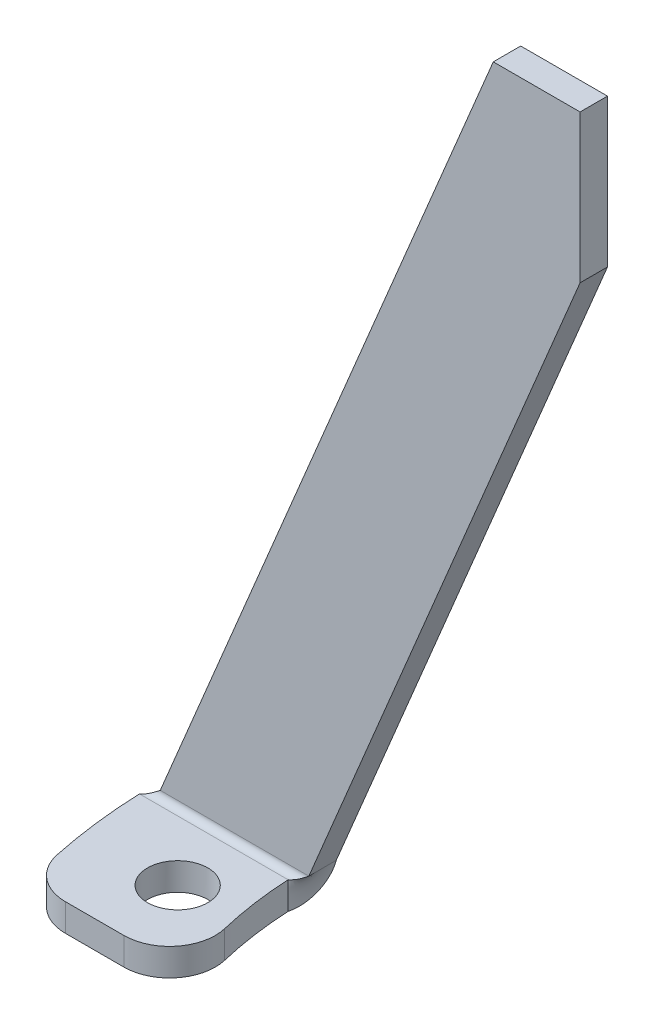
ISO-10303-21;
HEADER;
FILE_DESCRIPTION(('STEP AP214'),'2;1');
FILE_NAME('part.step','',(''),(''),'','','');
FILE_SCHEMA(('AUTOMOTIVE_DESIGN { 1 0 10303 214 1 1 1 1 }'));
ENDSEC;
DATA;
#1=APPLICATION_CONTEXT('core data for automotive mechanical design processes');
#2=APPLICATION_PROTOCOL_DEFINITION('international standard','automotive_design',2000,#1);
#3=PRODUCT_CONTEXT('',#1,'mechanical');
#4=PRODUCT('Part','Part','',(#3));
#5=PRODUCT_RELATED_PRODUCT_CATEGORY('part','',(#4));
#6=PRODUCT_DEFINITION_FORMATION('','',#4);
#7=PRODUCT_DEFINITION_CONTEXT('part definition',#1,'design');
#8=PRODUCT_DEFINITION('design','',#6,#7);
#9=PRODUCT_DEFINITION_SHAPE('','',#8);
#10=(LENGTH_UNIT() NAMED_UNIT(*) SI_UNIT(.MILLI.,.METRE.));
#11=(NAMED_UNIT(*) PLANE_ANGLE_UNIT() SI_UNIT($,.RADIAN.));
#12=(NAMED_UNIT(*) SI_UNIT($,.STERADIAN.) SOLID_ANGLE_UNIT());
#13=UNCERTAINTY_MEASURE_WITH_UNIT(LENGTH_MEASURE(1.E-05),#10,'distance_accuracy_value','');
#14=(GEOMETRIC_REPRESENTATION_CONTEXT(3) GLOBAL_UNCERTAINTY_ASSIGNED_CONTEXT((#13)) GLOBAL_UNIT_ASSIGNED_CONTEXT((#10,
#11,#12)) REPRESENTATION_CONTEXT('',''));
#15=CARTESIAN_POINT('',(0.,0.,0.));
#16=DIRECTION('',(0.,0.,1.));
#17=DIRECTION('',(1.,0.,0.));
#18=AXIS2_PLACEMENT_3D('',#15,#16,#17);
#19=CARTESIAN_POINT('',(0.,3.00000000000001,0.));
#20=DIRECTION('',(0.,-1.,0.));
#21=DIRECTION('',(0.,0.,-1.));
#22=AXIS2_PLACEMENT_3D('',#19,#20,#21);
#23=PLANE('',#22);
#24=DIRECTION('',(-1.,0.,0.));
#25=VECTOR('',#24,1.);
#26=CARTESIAN_POINT('',(-58.4336375728912,2.99999999999995,16.5));
#27=LINE('',#26,#25);
#28=CARTESIAN_POINT('',(-48.1145216362969,2.99999999999995,16.5));
#29=VERTEX_POINT('',#28);
#30=CARTESIAN_POINT('',(-54.5188471132671,2.99999999999995,16.5));
#31=VERTEX_POINT('',#30);
#32=EDGE_CURVE('E178',#29,#31,#27,.T.);
#33=ORIENTED_EDGE('',*,*,#32,.F.);
#34=CARTESIAN_POINT('',(-48.1145216362969,2.99999999999996,11.5));
#35=DIRECTION('',(0.,-1.,0.));
#36=DIRECTION('',(0.,0.,-1.));
#37=AXIS2_PLACEMENT_3D('',#34,#35,#36);
#38=CIRCLE('',#37,5.);
#39=CARTESIAN_POINT('',(-43.251498118051,2.99999999999997,10.3376737717031));
#40=VERTEX_POINT('',#39);
#41=EDGE_CURVE('E314',#29,#40,#38,.F.);
#42=ORIENTED_EDGE('',*,*,#41,.T.);
#43=CARTESIAN_POINT('',(0.,3.00000000000001,0.));
#44=DIRECTION('',(0.,-1.,0.));
#45=DIRECTION('',(0.,0.,-1.));
#46=AXIS2_PLACEMENT_3D('',#43,#44,#45);
#47=CIRCLE('',#46,44.4697603823758);
#48=CARTESIAN_POINT('',(-44.4134800359747,3.,2.2366));
#49=VERTEX_POINT('',#48);
#50=EDGE_CURVE('E184',#49,#40,#47,.F.);
#51=ORIENTED_EDGE('',*,*,#50,.F.);
#52=DIRECTION('',(-1.,0.,0.));
#53=VECTOR('',#52,1.);
#54=CARTESIAN_POINT('',(-60.6773237745371,3.,2.2366));
#55=LINE('',#54,#53);
#56=CARTESIAN_POINT('',(-60.6773237745371,3.,2.2366));
#57=VERTEX_POINT('',#56);
#58=EDGE_CURVE('E166',#57,#49,#55,.F.);
#59=ORIENTED_EDGE('',*,*,#58,.F.);
#60=CARTESIAN_POINT('',(0.,3.00000000000001,0.));
#61=DIRECTION('',(0.,-1.,0.));
#62=DIRECTION('',(0.,0.,-1.));
#63=AXIS2_PLACEMENT_3D('',#60,#61,#62);
#64=CIRCLE('',#63,60.7185309440207);
#65=CARTESIAN_POINT('',(-59.4111913827204,2.99999999999996,12.5319726494184));
#66=VERTEX_POINT('',#65);
#67=EDGE_CURVE('E172',#66,#57,#64,.T.);
#68=ORIENTED_EDGE('',*,*,#67,.F.);
#69=CARTESIAN_POINT('',(-54.5188471132671,2.99999999999996,11.5));
#70=DIRECTION('',(0.,-1.,0.));
#71=DIRECTION('',(0.,0.,-1.));
#72=AXIS2_PLACEMENT_3D('',#69,#70,#71);
#73=CIRCLE('',#72,5.);
#74=EDGE_CURVE('E312',#66,#31,#73,.F.);
#75=ORIENTED_EDGE('',*,*,#74,.T.);
#76=EDGE_LOOP('',(#33,#42,#51,#59,#68,#75));
#77=FACE_BOUND('',#76,.T.);
#78=CARTESIAN_POINT('',(-49.929753077719,2.99999999999997,8.80396260771304));
#79=DIRECTION('',(0.,1.,0.));
#80=DIRECTION('',(0.,0.,1.));
#81=AXIS2_PLACEMENT_3D('',#78,#79,#80);
#82=CIRCLE('',#81,3.29999999999999);
#83=CARTESIAN_POINT('',(-49.929753077719,2.99999999999996,12.103962607713));
#84=VERTEX_POINT('',#83);
#85=EDGE_CURVE('E535',#84,#84,#82,.T.);
#86=ORIENTED_EDGE('',*,*,#85,.F.);
#87=EDGE_LOOP('',(#86));
#88=FACE_BOUND('',#87,.T.);
#89=ADVANCED_FACE('F61',(#77,#88),#23,.F.);
#90=CARTESIAN_POINT('',(-60.7,0.,-1.5));
#91=DIRECTION('',(-0.922762053522103,0.38537020198722,0.));
#92=DIRECTION('',(-0.38537020198722,-0.922762053522104,0.));
#93=AXIS2_PLACEMENT_3D('',#90,#91,#92);
#94=PLANE('',#93);
#95=DIRECTION('',(-0.38537020198722,-0.922762053522104,0.));
#96=VECTOR('',#95,1.);
#97=CARTESIAN_POINT('',(-60.7,0.,-1.5));
#98=LINE('',#97,#96);
#99=CARTESIAN_POINT('',(-22.704238950228,90.9801700043885,-1.5));
#100=VERTEX_POINT('',#99);
#101=CARTESIAN_POINT('',(-59.1394955435703,3.73660000000002,-1.5));
#102=VERTEX_POINT('',#101);
#103=EDGE_CURVE('E342',#100,#102,#98,.T.);
#104=ORIENTED_EDGE('',*,*,#103,.T.);
#105=DIRECTION('',(0.,0.,-1.));
#106=VECTOR('',#105,1.);
#107=CARTESIAN_POINT('',(-59.1394955435703,3.7366,1.5));
#108=LINE('',#107,#106);
#109=CARTESIAN_POINT('',(-59.1394955435703,3.7366,1.5));
#110=VERTEX_POINT('',#109);
#111=EDGE_CURVE('E196',#110,#102,#108,.T.);
#112=ORIENTED_EDGE('',*,*,#111,.F.);
#113=DIRECTION('',(-0.38537020198722,-0.922762053522104,0.));
#114=VECTOR('',#113,1.);
#115=CARTESIAN_POINT('',(-60.7,0.,1.5));
#116=LINE('',#115,#114);
#117=CARTESIAN_POINT('',(-22.704238950228,90.9801700043885,1.5));
#118=VERTEX_POINT('',#117);
#119=EDGE_CURVE('E334',#118,#110,#116,.T.);
#120=ORIENTED_EDGE('',*,*,#119,.F.);
#121=DIRECTION('',(0.,0.,1.));
#122=VECTOR('',#121,1.);
#123=CARTESIAN_POINT('',(-22.704238950228,90.9801700043885,-1.5));
#124=LINE('',#123,#122);
#125=EDGE_CURVE('E343',#100,#118,#124,.T.);
#126=ORIENTED_EDGE('',*,*,#125,.F.);
#127=EDGE_LOOP('',(#104,#112,#120,#126));
#128=FACE_BOUND('',#127,.T.);
#129=ADVANCED_FACE('F263',(#128),#94,.T.);
#130=CARTESIAN_POINT('',(-44.4444550924626,0.,-1.5));
#131=DIRECTION('',(0.922762053522103,-0.38537020198722,0.));
#132=DIRECTION('',(0.38537020198722,0.922762053522104,0.));
#133=AXIS2_PLACEMENT_3D('',#130,#131,#132);
#134=PLANE('',#133);
#135=DIRECTION('',(0.38537020198722,0.922762053522103,0.));
#136=VECTOR('',#135,1.);
#137=CARTESIAN_POINT('',(-44.4444550924626,0.,1.5));
#138=LINE('',#137,#136);
#139=CARTESIAN_POINT('',(-42.8839506360329,3.7366,1.5));
#140=VERTEX_POINT('',#139);
#141=CARTESIAN_POINT('',(-13.21,74.7903438645226,1.5));
#142=VERTEX_POINT('',#141);
#143=EDGE_CURVE('E199',#140,#142,#138,.T.);
#144=ORIENTED_EDGE('',*,*,#143,.F.);
#145=DIRECTION('',(0.,0.,-1.));
#146=VECTOR('',#145,1.);
#147=CARTESIAN_POINT('',(-42.8839506360329,3.7366,1.5));
#148=LINE('',#147,#146);
#149=CARTESIAN_POINT('',(-42.8839506360329,3.7366,-1.5));
#150=VERTEX_POINT('',#149);
#151=EDGE_CURVE('E200',#140,#150,#148,.T.);
#152=ORIENTED_EDGE('',*,*,#151,.T.);
#153=DIRECTION('',(0.38537020198722,0.922762053522103,0.));
#154=VECTOR('',#153,1.);
#155=CARTESIAN_POINT('',(-44.4444550924626,0.,-1.5));
#156=LINE('',#155,#154);
#157=CARTESIAN_POINT('',(-13.21,74.7903438645226,-1.5));
#158=VERTEX_POINT('',#157);
#159=EDGE_CURVE('E240',#150,#158,#156,.T.);
#160=ORIENTED_EDGE('',*,*,#159,.T.);
#161=DIRECTION('',(0.,0.,1.));
#162=VECTOR('',#161,1.);
#163=CARTESIAN_POINT('',(-13.21,74.7903438645226,-1.5));
#164=LINE('',#163,#162);
#165=EDGE_CURVE('E346',#158,#142,#164,.T.);
#166=ORIENTED_EDGE('',*,*,#165,.T.);
#167=EDGE_LOOP('',(#144,#152,#160,#166));
#168=FACE_BOUND('',#167,.T.);
#169=ADVANCED_FACE('F257',(#168),#134,.T.);
#170=CARTESIAN_POINT('',(0.,0.,-1.5));
#171=DIRECTION('',(0.,0.,-1.));
#172=DIRECTION('',(-1.,0.,0.));
#173=AXIS2_PLACEMENT_3D('',#170,#171,#172);
#174=PLANE('',#173);
#175=ORIENTED_EDGE('',*,*,#159,.F.);
#176=DIRECTION('',(1.,0.,0.));
#177=VECTOR('',#176,1.);
#178=CARTESIAN_POINT('',(-42.8839506360329,3.7366,-1.5));
#179=LINE('',#178,#177);
#180=EDGE_CURVE('E154',#150,#102,#179,.F.);
#181=ORIENTED_EDGE('',*,*,#180,.T.);
#182=ORIENTED_EDGE('',*,*,#103,.F.);
#183=DIRECTION('',(-1.,0.,0.));
#184=VECTOR('',#183,1.);
#185=CARTESIAN_POINT('',(-13.21,90.9801700043885,-1.5));
#186=LINE('',#185,#184);
#187=CARTESIAN_POINT('',(-13.21,90.9801700043885,-1.5));
#188=VERTEX_POINT('',#187);
#189=EDGE_CURVE('E347',#188,#100,#186,.T.);
#190=ORIENTED_EDGE('',*,*,#189,.F.);
#191=DIRECTION('',(0.,1.,0.));
#192=VECTOR('',#191,1.);
#193=CARTESIAN_POINT('',(-13.21,74.7903438645226,-1.5));
#194=LINE('',#193,#192);
#195=EDGE_CURVE('E352',#158,#188,#194,.T.);
#196=ORIENTED_EDGE('',*,*,#195,.F.);
#197=EDGE_LOOP('',(#175,#181,#182,#190,#196));
#198=FACE_BOUND('',#197,.T.);
#199=ADVANCED_FACE('F247',(#198),#174,.T.);
#200=CARTESIAN_POINT('',(0.,0.,1.5));
#201=DIRECTION('',(0.,0.,-1.));
#202=DIRECTION('',(-1.,0.,0.));
#203=AXIS2_PLACEMENT_3D('',#200,#201,#202);
#204=PLANE('',#203);
#205=DIRECTION('',(1.,0.,0.));
#206=VECTOR('',#205,1.);
#207=CARTESIAN_POINT('',(-42.8839506360329,3.7366,1.5));
#208=LINE('',#207,#206);
#209=EDGE_CURVE('E192',#140,#110,#208,.F.);
#210=ORIENTED_EDGE('',*,*,#209,.F.);
#211=ORIENTED_EDGE('',*,*,#143,.T.);
#212=DIRECTION('',(0.,1.,0.));
#213=VECTOR('',#212,1.);
#214=CARTESIAN_POINT('',(-13.21,74.7903438645226,1.5));
#215=LINE('',#214,#213);
#216=CARTESIAN_POINT('',(-13.21,90.9801700043885,1.5));
#217=VERTEX_POINT('',#216);
#218=EDGE_CURVE('E356',#142,#217,#215,.T.);
#219=ORIENTED_EDGE('',*,*,#218,.T.);
#220=DIRECTION('',(-1.,0.,0.));
#221=VECTOR('',#220,1.);
#222=CARTESIAN_POINT('',(-13.21,90.9801700043885,1.5));
#223=LINE('',#222,#221);
#224=EDGE_CURVE('E338',#217,#118,#223,.T.);
#225=ORIENTED_EDGE('',*,*,#224,.T.);
#226=ORIENTED_EDGE('',*,*,#119,.T.);
#227=EDGE_LOOP('',(#210,#211,#219,#225,#226));
#228=FACE_BOUND('',#227,.T.);
#229=ADVANCED_FACE('F256',(#228),#204,.F.);
#230=CARTESIAN_POINT('',(-13.21,90.9801700043885,-1.5));
#231=DIRECTION('',(0.,1.,0.));
#232=DIRECTION('',(0.,0.,1.));
#233=AXIS2_PLACEMENT_3D('',#230,#231,#232);
#234=PLANE('',#233);
#235=ORIENTED_EDGE('',*,*,#224,.F.);
#236=DIRECTION('',(0.,0.,1.));
#237=VECTOR('',#236,1.);
#238=CARTESIAN_POINT('',(-13.21,90.9801700043885,-1.5));
#239=LINE('',#238,#237);
#240=EDGE_CURVE('E350',#188,#217,#239,.T.);
#241=ORIENTED_EDGE('',*,*,#240,.F.);
#242=ORIENTED_EDGE('',*,*,#189,.T.);
#243=ORIENTED_EDGE('',*,*,#125,.T.);
#244=EDGE_LOOP('',(#235,#241,#242,#243));
#245=FACE_BOUND('',#244,.T.);
#246=ADVANCED_FACE('F261',(#245),#234,.T.);
#247=CARTESIAN_POINT('',(-13.21,74.7903438645226,-1.5));
#248=DIRECTION('',(1.,0.,0.));
#249=DIRECTION('',(0.,0.,-1.));
#250=AXIS2_PLACEMENT_3D('',#247,#248,#249);
#251=PLANE('',#250);
#252=ORIENTED_EDGE('',*,*,#218,.F.);
#253=ORIENTED_EDGE('',*,*,#165,.F.);
#254=ORIENTED_EDGE('',*,*,#195,.T.);
#255=ORIENTED_EDGE('',*,*,#240,.T.);
#256=EDGE_LOOP('',(#252,#253,#254,#255));
#257=FACE_BOUND('',#256,.T.);
#258=ADVANCED_FACE('F269',(#257),#251,.T.);
#259=CARTESIAN_POINT('',(-59.1394955435703,3.73659999999999,-1.53));
#260=CARTESIAN_POINT('',(-59.2676696501249,3.24346992851546,-1.53));
#261=CARTESIAN_POINT('',(-59.3958002487314,2.75070041877233,-1.43196548393888));
#262=CARTESIAN_POINT('',(-59.6521049538926,1.83966874853497,-1.05460381037515));
#263=CARTESIAN_POINT('',(-59.7802573064731,1.42184832454248,-0.775425128576989));
#264=CARTESIAN_POINT('',(-60.0365620116343,0.724574871423014,-0.0781516754575199));
#265=CARTESIAN_POINT('',(-60.1647143642148,0.445396189624852,0.339668748534964));
#266=CARTESIAN_POINT('',(-60.421019069376,0.0680345160611211,1.25070041877233));
#267=CARTESIAN_POINT('',(-60.5491496679825,-0.0300000000000027,1.74346992851545));
#268=CARTESIAN_POINT('',(-60.6773237745371,-0.0300000000000039,2.23659999999999));
#269=CARTESIAN_POINT('',(-59.1394955435703,3.73659999999999,-1.5));
#270=CARTESIAN_POINT('',(-59.2676695174312,3.247397681714,-1.5));
#271=CARTESIAN_POINT('',(-59.3958002487314,2.75855285530311,-1.40274630363883));
#272=CARTESIAN_POINT('',(-59.6521049538926,1.85477731794609,-1.02839021872452));
#273=CARTESIAN_POINT('',(-59.7802573064731,1.44028472614173,-0.751435123305043));
#274=CARTESIAN_POINT('',(-60.0365620116343,0.74856487669496,-0.0597152738582724));
#275=CARTESIAN_POINT('',(-60.1647143642148,0.471609781275479,0.354777317946091));
#276=CARTESIAN_POINT('',(-60.421019069376,0.0972536963611706,1.2585528553031));
#277=CARTESIAN_POINT('',(-60.5491498006762,0.,1.747397681714));
#278=CARTESIAN_POINT('',(-60.6773237745371,0.,2.23659999999999));
#279=CARTESIAN_POINT('',(-59.1394955435703,3.7366,1.5));
#280=CARTESIAN_POINT('',(-59.2676562480612,3.64017300156896,1.5));
#281=CARTESIAN_POINT('',(-59.3958002487314,3.54379650838095,1.51917172636612));
#282=CARTESIAN_POINT('',(-59.6521049538926,3.36563425905879,1.59296894633825));
#283=CARTESIAN_POINT('',(-59.7802573064731,3.28392488606647,1.6475654038895));
#284=CARTESIAN_POINT('',(-60.0365620116343,3.1475654038895,1.78392488606648));
#285=CARTESIAN_POINT('',(-60.1647143642148,3.09296894633825,1.86563425905879));
#286=CARTESIAN_POINT('',(-60.421019069376,3.01917172636611,2.04379650838095));
#287=CARTESIAN_POINT('',(-60.5491630700462,3.,2.14017300156897));
#288=CARTESIAN_POINT('',(-60.6773237745371,3.,2.2366));
#289=CARTESIAN_POINT('',(-59.1394955435703,3.7366,1.5303));
#290=CARTESIAN_POINT('',(-59.2676561140406,3.64414003229949,1.5303));
#291=CARTESIAN_POINT('',(-59.3958002487314,3.55172746927704,1.54868309846917));
#292=CARTESIAN_POINT('',(-59.6521049538926,3.38089391416403,1.61944467390539));
#293=CARTESIAN_POINT('',(-59.7802573064731,3.30254565168171,1.67179530921416));
#294=CARTESIAN_POINT('',(-60.0365620116343,3.17179530921416,1.80254565168172));
#295=CARTESIAN_POINT('',(-60.1647143642148,3.11944467390538,1.88089391416403));
#296=CARTESIAN_POINT('',(-60.421019069376,3.04868309846916,2.05172746927704));
#297=CARTESIAN_POINT('',(-60.5491632040669,3.0303,2.1441400322995));
#298=CARTESIAN_POINT('',(-60.6773237745371,3.0303,2.2366));
#299=B_SPLINE_SURFACE_WITH_KNOTS('',1,3,((#259,#260,#261,#262,#263,#264,#265,#266,#267,#268),
(#269,#270,#271,#272,#273,#274,#275,#276,#277,#278),(#279,#280,#281,#282,#283,#284,#285,#286,
#287,#288),(#289,#290,#291,#292,#293,#294,#295,#296,#297,#298)),.UNSPECIFIED.,.F.,.F.,.F.,(2,1,
1,2),(4,2,2,2,4),(-0.01,0.,1.,1.0101),(0.,0.25,0.5,0.75,1.),.UNSPECIFIED.);
#300=DIRECTION('',(0.,1.,0.));
#301=VECTOR('',#300,1.);
#302=CARTESIAN_POINT('',(-60.6773237745371,0.,2.23659999999999));
#303=LINE('',#302,#301);
#304=CARTESIAN_POINT('',(-60.6773237745371,0.,2.23659999999999));
#305=VERTEX_POINT('',#304);
#306=EDGE_CURVE('E188',#57,#305,#303,.F.);
#307=CARTESIAN_POINT('',(-59.1394955435703,3.7366,1.5));
#308=CARTESIAN_POINT('',(-59.1854237754994,3.70204544770689,1.49998321665004));
#309=CARTESIAN_POINT('',(-59.2313486602446,3.66749322988436,1.50243086287394));
#310=CARTESIAN_POINT('',(-59.3231917189433,3.59907296045827,1.51213254386796));
#311=CARTESIAN_POINT('',(-59.3691098930084,3.56520482252566,1.51938596820693));
#312=CARTESIAN_POINT('',(-59.4608057576581,3.49892819748402,1.53854640636872));
#313=CARTESIAN_POINT('',(-59.506583432639,3.46651542767897,1.55043861074728));
#314=CARTESIAN_POINT('',(-59.5981234546736,3.40367498850569,1.57862684178971));
#315=CARTESIAN_POINT('',(-59.6438858023005,3.37324723405487,1.59492267954899));
#316=CARTESIAN_POINT('',(-59.7817201076693,3.28550153869367,1.65019699660191));
#317=CARTESIAN_POINT('',(-59.873863040066,3.23207852151706,1.69545721869461));
#318=CARTESIAN_POINT('',(-60.0580532280112,3.14001397111105,1.79902908873082));
#319=CARTESIAN_POINT('',(-60.1501005078074,3.10136360118307,1.85733290106544));
#320=CARTESIAN_POINT('',(-60.3146247013664,3.04812829315907,1.96908351352331));
#321=CARTESIAN_POINT('',(-60.3871073309903,3.03017613562213,2.0209332385344));
#322=CARTESIAN_POINT('',(-60.495849176932,3.01212234212555,2.10073445449341));
#323=CARTESIAN_POINT('',(-60.5321373385147,3.00758339800654,2.12770184890384));
#324=CARTESIAN_POINT('',(-60.6047214226424,3.00151986839201,2.18197752498983));
#325=CARTESIAN_POINT('',(-60.6410173453406,2.99999586144471,2.20928587108042));
#326=CARTESIAN_POINT('',(-60.6773237745371,3.,2.2366));
#327=B_SPLINE_CURVE_WITH_KNOTS('',3,(#307,#308,#309,#310,#311,#312,#313,#314,#315,#316,#317,
#318,#319,#320,#321,#322,#323,#324,#325,#326),.UNSPECIFIED.,.F.,.F.,(4,2,2,2,2,2,2,2,2,4),(0.,
0.172367386819384,0.344712883686001,0.516512607276439,0.688304962268391,1.03368041067894,
1.37884893794278,1.65073140886628,1.78695739619406,1.92320952193124),.UNSPECIFIED.);
#328=EDGE_CURVE('E157',#110,#57,#327,.T.);
#329=CARTESIAN_POINT('',(-59.1394955435703,3.73659999999999,-1.5));
#330=CARTESIAN_POINT('',(-59.1723064895419,3.61137742262891,-1.5000230426414));
#331=CARTESIAN_POINT('',(-59.205115922797,3.48615751927998,-1.49370632332663));
#332=CARTESIAN_POINT('',(-59.2707348154448,3.23697309748761,-1.46855695446708));
#333=CARTESIAN_POINT('',(-59.3035442747454,3.11300864641526,-1.44972363682186));
#334=CARTESIAN_POINT('',(-59.369084964585,2.86788978561869,-1.39976400495057));
#335=CARTESIAN_POINT('',(-59.4018161961306,2.74672940928744,-1.36866694821185));
#336=CARTESIAN_POINT('',(-59.4672765113073,2.50814830432059,-1.29450218996525));
#337=CARTESIAN_POINT('',(-59.5000055942487,2.39072690041784,-1.2514366638151));
#338=CARTESIAN_POINT('',(-59.5611984779271,2.17576846677327,-1.16013270177122));
#339=CARTESIAN_POINT('',(-59.5896629556802,2.07763261705767,-1.11329720358342));
#340=CARTESIAN_POINT('',(-59.6465999765546,1.88577925462561,-1.01123767545624));
#341=CARTESIAN_POINT('',(-59.6750725194189,1.79206313116582,-0.956011030647292));
#342=CARTESIAN_POINT('',(-59.7319926012876,1.60987747858834,-0.837651439868116));
#343=CARTESIAN_POINT('',(-59.7604401412036,1.52140360813722,-0.774525174662202));
#344=CARTESIAN_POINT('',(-59.8173478032104,1.35025874693177,-0.640786483093799));
#345=CARTESIAN_POINT('',(-59.8458079262585,1.26758976667019,-0.57017148409758));
#346=CARTESIAN_POINT('',(-59.9027206552801,1.10873591278739,-0.422027897584694));
#347=CARTESIAN_POINT('',(-59.9311732613754,1.03254944410303,-0.34450102044983));
#348=CARTESIAN_POINT('',(-59.9880785396946,0.887216539646044,-0.183107800845709));
#349=CARTESIAN_POINT('',(-60.0165312119185,0.818070103708754,-0.0992414585247388));
#350=CARTESIAN_POINT('',(-60.0734536188638,0.687297150583732,0.0742539830246739));
#351=CARTESIAN_POINT('',(-60.1019233518411,0.625675845014923,0.163887011177221));
#352=CARTESIAN_POINT('',(-60.1588545755337,0.510498120750387,0.348149108997608));
#353=CARTESIAN_POINT('',(-60.1873160656733,0.456938905624552,0.442776430882999));
#354=CARTESIAN_POINT('',(-60.2442640868503,0.358225071237469,0.636417888050129));
#355=CARTESIAN_POINT('',(-60.2727506187855,0.313077569730298,0.735435651490465));
#356=CARTESIAN_POINT('',(-60.3297134392504,0.231601848435251,0.936992885321157));
#357=CARTESIAN_POINT('',(-60.3581897276298,0.195270339179754,1.03953102581878));
#358=CARTESIAN_POINT('',(-60.41510953321,0.131714987530551,1.24727145900643));
#359=CARTESIAN_POINT('',(-60.4435530531729,0.104481538567321,1.35247081463234));
#360=CARTESIAN_POINT('',(-60.5004284706962,0.0592859467643415,1.56480034439865));
#361=CARTESIAN_POINT('',(-60.5288603675618,0.0413195305489727,1.67192960495804));
#362=CARTESIAN_POINT('',(-60.5773127943445,0.0187022838437061,1.85547176232784));
#363=CARTESIAN_POINT('',(-60.5973347341221,0.0116850584573831,1.93160108584721));
#364=CARTESIAN_POINT('',(-60.6373451523784,0.00233684125188241,2.08401797752188));
#365=CARTESIAN_POINT('',(-60.6573336303746,-2.02941015532987E-06,2.16030506266755));
#366=CARTESIAN_POINT('',(-60.6773237745371,0.,2.23659999999999));
#367=B_SPLINE_CURVE_WITH_KNOTS('',3,(#329,#330,#331,#332,#333,#334,#335,#336,#337,#338,#339,
#340,#341,#342,#343,#344,#345,#346,#347,#348,#349,#350,#351,#352,#353,#354,#355,#356,#357,#358,
#359,#360,#361,#362,#363,#364,#365,#366),.UNSPECIFIED.,.F.,.F.,(4,2,2,2,2,2,2,2,2,2,2,2,2,2,2,2,
2,2,4),(0.,0.388191687479179,0.776404097191334,1.16369590108002,1.55091735780851,
1.88773731925705,2.22466245745237,2.56130455732744,2.89806268210781,3.23473770433776,
3.57141271869251,3.9083195946834,4.24510933996884,4.58218278563168,4.9191302666805,
5.25572083470199,5.59215604913654,5.82911581037234,6.06567616924802),.UNSPECIFIED.);
#368=EDGE_CURVE('E195',#102,#305,#367,.T.);
#369=ORIENTED_EDGE('',*,*,#306,.F.);
#370=ORIENTED_EDGE('',*,*,#328,.F.);
#371=ORIENTED_EDGE('',*,*,#111,.T.);
#372=ORIENTED_EDGE('',*,*,#368,.T.);
#373=EDGE_LOOP('',(#369,#370,#371,#372));
#374=FACE_BOUND('',#373,.T.);
#375=ADVANCED_FACE('F214',(#374),#299,.F.);
#376=CARTESIAN_POINT('',(-44.4134800359747,-0.0300000000000039,2.23659999999998));
#377=CARTESIAN_POINT('',(-44.2859976016133,-0.0300000000000016,1.74346987128086));
#378=CARTESIAN_POINT('',(-44.1585584693177,0.0680345160611221,1.25070041877232));
#379=CARTESIAN_POINT('',(-43.9036369026608,0.445396189624854,0.339668748534958));
#380=CARTESIAN_POINT('',(-43.7761761193323,0.724574871423018,-0.078151675457525));
#381=CARTESIAN_POINT('',(-43.5212545526753,1.42184832454249,-0.775425128576992));
#382=CARTESIAN_POINT('',(-43.3937937693468,1.83966874853497,-1.05460381037515));
#383=CARTESIAN_POINT('',(-43.1388722026899,2.75070041877234,-1.43196548393888));
#384=CARTESIAN_POINT('',(-43.0114330703943,3.24346987128089,-1.53));
#385=CARTESIAN_POINT('',(-42.8839506360329,3.7366,-1.53));
#386=CARTESIAN_POINT('',(-44.4134800359747,0.,2.23659999999998));
#387=CARTESIAN_POINT('',(-44.2859977331649,0.,1.74739762461551));
#388=CARTESIAN_POINT('',(-44.1585584693177,0.0972536963611716,1.2585528553031));
#389=CARTESIAN_POINT('',(-43.9036369026608,0.471609781275482,0.354777317946085));
#390=CARTESIAN_POINT('',(-43.7761761193323,0.748564876694963,-0.0597152738582775));
#391=CARTESIAN_POINT('',(-43.5212545526753,1.44028472614174,-0.751435123305047));
#392=CARTESIAN_POINT('',(-43.3937937693468,1.8547773179461,-1.02839021872453));
#393=CARTESIAN_POINT('',(-43.1388722026899,2.75855285530311,-1.40274630363883));
#394=CARTESIAN_POINT('',(-43.0114329388427,3.24739762461554,-1.5));
#395=CARTESIAN_POINT('',(-42.8839506360329,3.7366,-1.5));
#396=CARTESIAN_POINT('',(-44.4134800359747,3.,2.2366));
#397=CARTESIAN_POINT('',(-44.2860108883184,3.,2.14017295808061));
#398=CARTESIAN_POINT('',(-44.1585584693177,3.01917172636612,2.04379650838095));
#399=CARTESIAN_POINT('',(-43.9036369026608,3.09296894633825,1.86563425905879));
#400=CARTESIAN_POINT('',(-43.7761761193323,3.1475654038895,1.78392488606647));
#401=CARTESIAN_POINT('',(-43.5212545526753,3.28392488606648,1.6475654038895));
#402=CARTESIAN_POINT('',(-43.3937937693468,3.36563425905879,1.59296894633825));
#403=CARTESIAN_POINT('',(-43.1388722026899,3.54379650838095,1.51917172636612));
#404=CARTESIAN_POINT('',(-43.0114197836892,3.64017295808062,1.5));
#405=CARTESIAN_POINT('',(-42.8839506360329,3.7366,1.5));
#406=CARTESIAN_POINT('',(-44.4134800359747,3.0303,2.2366));
#407=CARTESIAN_POINT('',(-44.2860110211855,3.0303,2.14413998894861));
#408=CARTESIAN_POINT('',(-44.1585584693177,3.04868309846917,2.05172746927704));
#409=CARTESIAN_POINT('',(-43.9036369026608,3.11944467390538,1.88089391416403));
#410=CARTESIAN_POINT('',(-43.7761761193323,3.17179530921416,1.80254565168171));
#411=CARTESIAN_POINT('',(-43.5212545526753,3.30254565168172,1.67179530921416));
#412=CARTESIAN_POINT('',(-43.3937937693468,3.38089391416403,1.61944467390539));
#413=CARTESIAN_POINT('',(-43.1388722026899,3.55172746927704,1.54868309846917));
#414=CARTESIAN_POINT('',(-43.0114196508221,3.64413998894862,1.5303));
#415=CARTESIAN_POINT('',(-42.8839506360329,3.7366,1.5303));
#416=B_SPLINE_SURFACE_WITH_KNOTS('',1,3,((#376,#377,#378,#379,#380,#381,#382,#383,#384,#385),
(#386,#387,#388,#389,#390,#391,#392,#393,#394,#395),(#396,#397,#398,#399,#400,#401,#402,#403,
#404,#405),(#406,#407,#408,#409,#410,#411,#412,#413,#414,#415)),.UNSPECIFIED.,.F.,.F.,.F.,(2,1,
1,2),(4,2,2,2,4),(-0.01,0.,1.,1.0101),(0.,0.25,0.5,0.75,1.),.UNSPECIFIED.);
#417=CARTESIAN_POINT('',(-44.4134800359747,3.,2.2366));
#418=CARTESIAN_POINT('',(-44.3679560740095,2.99998345043644,2.20216380741246));
#419=CARTESIAN_POINT('',(-44.3224354445839,3.00241424704779,2.16772989852717));
#420=CARTESIAN_POINT('',(-44.2314008242077,3.01204974766428,2.09953926526286));
#421=CARTESIAN_POINT('',(-44.1858868331455,3.01925384797641,2.06578245580534));
#422=CARTESIAN_POINT('',(-44.0949990683597,3.03828484198022,1.99971507779707));
#423=CARTESIAN_POINT('',(-44.0496253102271,3.05009692406377,1.96740024146844));
#424=CARTESIAN_POINT('',(-43.9588929477284,3.0780973894395,1.90473574933707));
#425=CARTESIAN_POINT('',(-43.9135343428023,3.09428558753991,1.87438601044121));
#426=CARTESIAN_POINT('',(-43.7769226335404,3.14919785916936,1.78684061766283));
#427=CARTESIAN_POINT('',(-43.6855991069064,3.19416676067602,1.73349993525238));
#428=CARTESIAN_POINT('',(-43.5030452524747,3.29710694751694,1.64145647053443));
#429=CARTESIAN_POINT('',(-43.411814901215,3.35507081855822,1.60274537499323));
#430=CARTESIAN_POINT('',(-43.2478660730982,3.46682581741158,1.54897217443822));
#431=CARTESIAN_POINT('',(-43.1751429523017,3.51908190893094,1.53070725242683));
#432=CARTESIAN_POINT('',(-43.0660390748493,3.59954718736104,1.51233676062529));
#433=CARTESIAN_POINT('',(-43.0296281858471,3.62674661516347,1.50771765156341));
#434=CARTESIAN_POINT('',(-42.9567987159548,3.68149529647001,1.50154687527363));
#435=CARTESIAN_POINT('',(-42.9203801349118,3.70904461513195,1.49999578806893));
#436=CARTESIAN_POINT('',(-42.8839506360329,3.7366,1.5));
#437=B_SPLINE_CURVE_WITH_KNOTS('',3,(#417,#418,#419,#420,#421,#422,#423,#424,#425,#426,#427,
#428,#429,#430,#431,#432,#433,#434,#435,#436),.UNSPECIFIED.,.F.,.F.,(4,2,2,2,2,2,2,2,2,4),(0.,
0.171185766004158,0.342349885799501,0.512968300465904,0.68357949590366,1.02655540182681,
1.36933611826913,1.64264808029675,1.77960319260748,1.91658419441809),.UNSPECIFIED.);
#438=EDGE_CURVE('E164',#49,#140,#437,.T.);
#439=DIRECTION('',(0.,1.,0.));
#440=VECTOR('',#439,1.);
#441=CARTESIAN_POINT('',(-44.4134800359747,0.,2.23659999999999));
#442=LINE('',#441,#440);
#443=CARTESIAN_POINT('',(-44.4134800359747,0.,2.23659999999999));
#444=VERTEX_POINT('',#443);
#445=EDGE_CURVE('E161',#49,#444,#442,.F.);
#446=CARTESIAN_POINT('',(-44.4134800359747,0.,2.23659999999998));
#447=CARTESIAN_POINT('',(-44.3808334989304,-2.30794863346658E-05,2.11132887164245));
#448=CARTESIAN_POINT('',(-44.3481884702756,0.00629855653511437,1.98606042336027));
#449=CARTESIAN_POINT('',(-44.2828983666179,0.0314674155515457,1.73678029498909));
#450=CARTESIAN_POINT('',(-44.250253291708,0.0503153156716634,1.61276868320813));
#451=CARTESIAN_POINT('',(-44.18504128992,0.100313231896303,1.36755972383066));
#452=CARTESIAN_POINT('',(-44.1524743620431,0.131433849595731,1.24635637847432));
#453=CARTESIAN_POINT('',(-44.0873426715813,0.205654351940819,1.0076936395535));
#454=CARTESIAN_POINT('',(-44.0547779096878,0.248752047160407,0.890233566084075));
#455=CARTESIAN_POINT('',(-43.9939125170748,0.340093182087242,0.675279527352206));
#456=CARTESIAN_POINT('',(-43.9656112058672,0.386926489173154,0.577183397887707));
#457=CARTESIAN_POINT('',(-43.9090011597562,0.488974355259741,0.385409519047745));
#458=CARTESIAN_POINT('',(-43.880692425092,0.544191351966801,0.291733065189228));
#459=CARTESIAN_POINT('',(-43.8240946220717,0.662536320907904,0.10960706277991));
#460=CARTESIAN_POINT('',(-43.7958055530151,0.725659071449821,0.0211541203659357));
#461=CARTESIAN_POINT('',(-43.7392247402743,0.859364409815491,-0.149920604840074));
#462=CARTESIAN_POINT('',(-43.7109329965973,0.929946978217097,-0.232542402812958));
#463=CARTESIAN_POINT('',(-43.654347069885,1.07804420459595,-0.391336253110677));
#464=CARTESIAN_POINT('',(-43.6260528868988,1.15555957620573,-0.467507639883574));
#465=CARTESIAN_POINT('',(-43.5694743859696,1.31689915256061,-0.612787203869854));
#466=CARTESIAN_POINT('',(-43.5411900680446,1.40072113664199,-0.68189784726476));
#467=CARTESIAN_POINT('',(-43.4845991506914,1.57413837173511,-0.812619561453448));
#468=CARTESIAN_POINT('',(-43.4562925534621,1.66373861846199,-0.874224005989945));
#469=CARTESIAN_POINT('',(-43.3996882836876,1.84792989225845,-0.989372227206857));
#470=CARTESIAN_POINT('',(-43.3713906117546,1.94251904413635,-1.04291900379096));
#471=CARTESIAN_POINT('',(-43.3147700301388,2.13608291792052,-1.14161502585736));
#472=CARTESIAN_POINT('',(-43.2864471195451,2.23506131686509,-1.18675705929457));
#473=CARTESIAN_POINT('',(-43.2298114861998,2.43653840132804,-1.26822842486289));
#474=CARTESIAN_POINT('',(-43.2014987635962,2.53903575757446,-1.30456104379694));
#475=CARTESIAN_POINT('',(-43.1449058343751,2.74669430709456,-1.36812543256722));
#476=CARTESIAN_POINT('',(-43.1166256250257,2.85185256964711,-1.39536678306975));
#477=CARTESIAN_POINT('',(-43.0600767663103,3.06410024584908,-1.44058497694851));
#478=CARTESIAN_POINT('',(-43.0318081176253,3.17118874688577,-1.4585660854902));
#479=CARTESIAN_POINT('',(-42.9835927475142,3.35481915480992,-1.48123345689179));
#480=CARTESIAN_POINT('',(-42.9636446399027,3.43107830465186,-1.48827478859366));
#481=CARTESIAN_POINT('',(-42.9237817851366,3.5837560122,-1.49765513022735));
#482=CARTESIAN_POINT('',(-42.9038670384676,3.66017408404045,-1.50000205196551));
#483=CARTESIAN_POINT('',(-42.8839506360329,3.7366,-1.5));
#484=B_SPLINE_CURVE_WITH_KNOTS('',3,(#446,#447,#448,#449,#450,#451,#452,#453,#454,#455,#456,
#457,#458,#459,#460,#461,#462,#463,#464,#465,#466,#467,#468,#469,#470,#471,#472,#473,#474,#475,
#476,#477,#478,#479,#480,#481,#482,#483),.UNSPECIFIED.,.F.,.F.,(4,2,2,2,2,2,2,2,2,2,2,2,2,2,2,2,
2,2,4),(0.,0.388207673144568,0.776436333117623,1.16374061391064,1.55097414147217,
1.88756397878504,2.22425187365308,2.56071854994684,2.89718435024814,3.23368482482061,
3.57006736153336,3.90674472815934,4.24329643660081,4.58013561970971,4.91684893366653,
5.25320627965945,5.58940856429565,5.82669324552918,6.06357767675615),.UNSPECIFIED.);
#485=EDGE_CURVE('E147',#444,#150,#484,.T.);
#486=ORIENTED_EDGE('',*,*,#438,.F.);
#487=ORIENTED_EDGE('',*,*,#445,.T.);
#488=ORIENTED_EDGE('',*,*,#485,.T.);
#489=ORIENTED_EDGE('',*,*,#151,.F.);
#490=EDGE_LOOP('',(#486,#487,#488,#489));
#491=FACE_BOUND('',#490,.T.);
#492=ADVANCED_FACE('F162',(#491),#416,.F.);
#493=CARTESIAN_POINT('',(-42.8839506360329,3.7366,2.2366));
#494=DIRECTION('',(1.,0.,0.));
#495=DIRECTION('',(0.,-1.,0.));
#496=AXIS2_PLACEMENT_3D('',#493,#494,#495);
#497=CYLINDRICAL_SURFACE('',#496,3.7366);
#498=ORIENTED_EDGE('',*,*,#180,.F.);
#499=ORIENTED_EDGE('',*,*,#485,.F.);
#500=DIRECTION('',(1.,0.,0.));
#501=VECTOR('',#500,1.);
#502=CARTESIAN_POINT('',(0.,0.,2.23659999999998));
#503=LINE('',#502,#501);
#504=EDGE_CURVE('E151',#305,#444,#503,.T.);
#505=ORIENTED_EDGE('',*,*,#504,.F.);
#506=ORIENTED_EDGE('',*,*,#368,.F.);
#507=EDGE_LOOP('',(#498,#499,#505,#506));
#508=FACE_BOUND('',#507,.T.);
#509=ADVANCED_FACE('F149',(#508),#497,.T.);
#510=CARTESIAN_POINT('',(-42.8839506360329,3.7366,2.2366));
#511=DIRECTION('',(1.,0.,0.));
#512=DIRECTION('',(0.,-1.,0.));
#513=AXIS2_PLACEMENT_3D('',#510,#511,#512);
#514=CYLINDRICAL_SURFACE('',#513,0.736600000000001);
#515=ORIENTED_EDGE('',*,*,#209,.T.);
#516=ORIENTED_EDGE('',*,*,#328,.T.);
#517=ORIENTED_EDGE('',*,*,#58,.T.);
#518=ORIENTED_EDGE('',*,*,#438,.T.);
#519=EDGE_LOOP('',(#515,#516,#517,#518));
#520=FACE_BOUND('',#519,.T.);
#521=ADVANCED_FACE('F222',(#520),#514,.F.);
#522=CARTESIAN_POINT('',(0.,0.,0.));
#523=DIRECTION('',(0.,1.,0.));
#524=DIRECTION('',(0.,0.,1.));
#525=AXIS2_PLACEMENT_3D('',#522,#523,#524);
#526=CYLINDRICAL_SURFACE('',#525,60.7185309440207);
#527=CARTESIAN_POINT('',(0.,0.,0.));
#528=DIRECTION('',(0.,-1.,0.));
#529=DIRECTION('',(0.,0.,-1.));
#530=AXIS2_PLACEMENT_3D('',#527,#528,#529);
#531=CIRCLE('',#530,60.7185309440207);
#532=CARTESIAN_POINT('',(-59.4111913827204,0.,12.5319726494183));
#533=VERTEX_POINT('',#532);
#534=EDGE_CURVE('E171',#533,#305,#531,.T.);
#535=ORIENTED_EDGE('',*,*,#534,.F.);
#536=DIRECTION('',(0.,1.,0.));
#537=VECTOR('',#536,1.);
#538=CARTESIAN_POINT('',(-59.4111913827204,0.,12.5319726494183));
#539=LINE('',#538,#537);
#540=EDGE_CURVE('E13',#533,#66,#539,.T.);
#541=ORIENTED_EDGE('',*,*,#540,.T.);
#542=ORIENTED_EDGE('',*,*,#67,.T.);
#543=ORIENTED_EDGE('',*,*,#306,.T.);
#544=EDGE_LOOP('',(#535,#541,#542,#543));
#545=FACE_BOUND('',#544,.T.);
#546=ADVANCED_FACE('F223',(#545),#526,.T.);
#547=CARTESIAN_POINT('',(0.,0.,0.));
#548=DIRECTION('',(0.,1.,0.));
#549=DIRECTION('',(0.,0.,1.));
#550=AXIS2_PLACEMENT_3D('',#547,#548,#549);
#551=CYLINDRICAL_SURFACE('',#550,44.4697603823758);
#552=ORIENTED_EDGE('',*,*,#50,.T.);
#553=DIRECTION('',(0.,1.,0.));
#554=VECTOR('',#553,1.);
#555=CARTESIAN_POINT('',(-43.251498118051,0.,10.3376737717031));
#556=LINE('',#555,#554);
#557=CARTESIAN_POINT('',(-43.251498118051,0.,10.3376737717031));
#558=VERTEX_POINT('',#557);
#559=EDGE_CURVE('E84',#40,#558,#556,.F.);
#560=ORIENTED_EDGE('',*,*,#559,.T.);
#561=CARTESIAN_POINT('',(0.,0.,0.));
#562=DIRECTION('',(0.,-1.,0.));
#563=DIRECTION('',(0.,0.,-1.));
#564=AXIS2_PLACEMENT_3D('',#561,#562,#563);
#565=CIRCLE('',#564,44.4697603823758);
#566=EDGE_CURVE('E169',#444,#558,#565,.F.);
#567=ORIENTED_EDGE('',*,*,#566,.F.);
#568=ORIENTED_EDGE('',*,*,#445,.F.);
#569=EDGE_LOOP('',(#552,#560,#567,#568));
#570=FACE_BOUND('',#569,.T.);
#571=ADVANCED_FACE('F174',(#570),#551,.F.);
#572=CARTESIAN_POINT('',(0.,0.,0.));
#573=DIRECTION('',(0.,-1.,0.));
#574=DIRECTION('',(0.,0.,-1.));
#575=AXIS2_PLACEMENT_3D('',#572,#573,#574);
#576=PLANE('',#575);
#577=CARTESIAN_POINT('',(-49.929753077719,0.,8.80396260771303));
#578=DIRECTION('',(0.,-1.,0.));
#579=DIRECTION('',(0.,0.,-1.));
#580=AXIS2_PLACEMENT_3D('',#577,#578,#579);
#581=CIRCLE('',#580,3.29999999999999);
#582=CARTESIAN_POINT('',(-49.929753077719,0.,5.50396260771303));
#583=VERTEX_POINT('',#582);
#584=EDGE_CURVE('E191',#583,#583,#581,.T.);
#585=ORIENTED_EDGE('',*,*,#584,.F.);
#586=EDGE_LOOP('',(#585));
#587=FACE_BOUND('',#586,.T.);
#588=ORIENTED_EDGE('',*,*,#566,.T.);
#589=CARTESIAN_POINT('',(-48.1145216362969,0.,11.5));
#590=DIRECTION('',(0.,-1.,0.));
#591=DIRECTION('',(0.,0.,-1.));
#592=AXIS2_PLACEMENT_3D('',#589,#590,#591);
#593=CIRCLE('',#592,5.);
#594=CARTESIAN_POINT('',(-48.1145216362969,0.,16.5));
#595=VERTEX_POINT('',#594);
#596=EDGE_CURVE('E69',#558,#595,#593,.T.);
#597=ORIENTED_EDGE('',*,*,#596,.T.);
#598=DIRECTION('',(1.,0.,0.));
#599=VECTOR('',#598,1.);
#600=CARTESIAN_POINT('',(0.,0.,16.5));
#601=LINE('',#600,#599);
#602=CARTESIAN_POINT('',(-54.5188471132671,0.,16.5));
#603=VERTEX_POINT('',#602);
#604=EDGE_CURVE('E175',#595,#603,#601,.F.);
#605=ORIENTED_EDGE('',*,*,#604,.T.);
#606=CARTESIAN_POINT('',(-54.5188471132671,0.,11.5));
#607=DIRECTION('',(0.,-1.,0.));
#608=DIRECTION('',(0.,0.,-1.));
#609=AXIS2_PLACEMENT_3D('',#606,#607,#608);
#610=CIRCLE('',#609,5.);
#611=EDGE_CURVE('E76',#603,#533,#610,.T.);
#612=ORIENTED_EDGE('',*,*,#611,.T.);
#613=ORIENTED_EDGE('',*,*,#534,.T.);
#614=ORIENTED_EDGE('',*,*,#504,.T.);
#615=EDGE_LOOP('',(#588,#597,#605,#612,#613,#614));
#616=FACE_BOUND('',#615,.T.);
#617=ADVANCED_FACE('F168',(#587,#616),#576,.T.);
#618=CARTESIAN_POINT('',(-58.4336375728912,0.,16.5));
#619=DIRECTION('',(0.,0.,-1.));
#620=DIRECTION('',(0.,1.,0.));
#621=AXIS2_PLACEMENT_3D('',#618,#619,#620);
#622=PLANE('',#621);
#623=ORIENTED_EDGE('',*,*,#604,.F.);
#624=DIRECTION('',(0.,1.,0.));
#625=VECTOR('',#624,1.);
#626=CARTESIAN_POINT('',(-48.1145216362969,0.,16.5));
#627=LINE('',#626,#625);
#628=EDGE_CURVE('E315',#595,#29,#627,.T.);
#629=ORIENTED_EDGE('',*,*,#628,.T.);
#630=ORIENTED_EDGE('',*,*,#32,.T.);
#631=DIRECTION('',(0.,1.,0.));
#632=VECTOR('',#631,1.);
#633=CARTESIAN_POINT('',(-54.5188471132671,0.,16.5));
#634=LINE('',#633,#632);
#635=EDGE_CURVE('E313',#31,#603,#634,.F.);
#636=ORIENTED_EDGE('',*,*,#635,.T.);
#637=EDGE_LOOP('',(#623,#629,#630,#636));
#638=FACE_BOUND('',#637,.T.);
#639=ADVANCED_FACE('F285',(#638),#622,.F.);
#640=CARTESIAN_POINT('',(-49.929753077719,2.99999999999997,8.80396260771304));
#641=DIRECTION('',(0.,1.,0.));
#642=DIRECTION('',(0.,0.,1.));
#643=AXIS2_PLACEMENT_3D('',#640,#641,#642);
#644=CYLINDRICAL_SURFACE('',#643,3.29999999999999);
#645=ORIENTED_EDGE('',*,*,#85,.T.);
#646=EDGE_LOOP('',(#645));
#647=FACE_BOUND('',#646,.T.);
#648=ORIENTED_EDGE('',*,*,#584,.T.);
#649=EDGE_LOOP('',(#648));
#650=FACE_BOUND('',#649,.T.);
#651=ADVANCED_FACE('F278',(#647,#650),#644,.F.);
#652=CARTESIAN_POINT('',(-48.1145216362969,0.,11.5));
#653=DIRECTION('',(0.,1.,0.));
#654=DIRECTION('',(0.,0.,1.));
#655=AXIS2_PLACEMENT_3D('',#652,#653,#654);
#656=CYLINDRICAL_SURFACE('',#655,5.);
#657=ORIENTED_EDGE('',*,*,#596,.F.);
#658=ORIENTED_EDGE('',*,*,#559,.F.);
#659=ORIENTED_EDGE('',*,*,#41,.F.);
#660=ORIENTED_EDGE('',*,*,#628,.F.);
#661=EDGE_LOOP('',(#657,#658,#659,#660));
#662=FACE_BOUND('',#661,.T.);
#663=ADVANCED_FACE('F276',(#662),#656,.T.);
#664=CARTESIAN_POINT('',(-54.5188471132671,0.,11.5));
#665=DIRECTION('',(0.,1.,0.));
#666=DIRECTION('',(0.,0.,1.));
#667=AXIS2_PLACEMENT_3D('',#664,#665,#666);
#668=CYLINDRICAL_SURFACE('',#667,5.);
#669=ORIENTED_EDGE('',*,*,#611,.F.);
#670=ORIENTED_EDGE('',*,*,#635,.F.);
#671=ORIENTED_EDGE('',*,*,#74,.F.);
#672=ORIENTED_EDGE('',*,*,#540,.F.);
#673=EDGE_LOOP('',(#669,#670,#671,#672));
#674=FACE_BOUND('',#673,.T.);
#675=ADVANCED_FACE('F63',(#674),#668,.T.);
#676=CLOSED_SHELL('',(#89,#129,#169,#199,#229,#246,#258,#375,#492,#509,#521,#546,#571,#617,#639,
#651,#663,#675));
#677=MANIFOLD_SOLID_BREP('B2',#676);
#678=ADVANCED_BREP_SHAPE_REPRESENTATION('',(#18,#677),#14);
#679=SHAPE_DEFINITION_REPRESENTATION(#9,#678);
ENDSEC;
END-ISO-10303-21;
